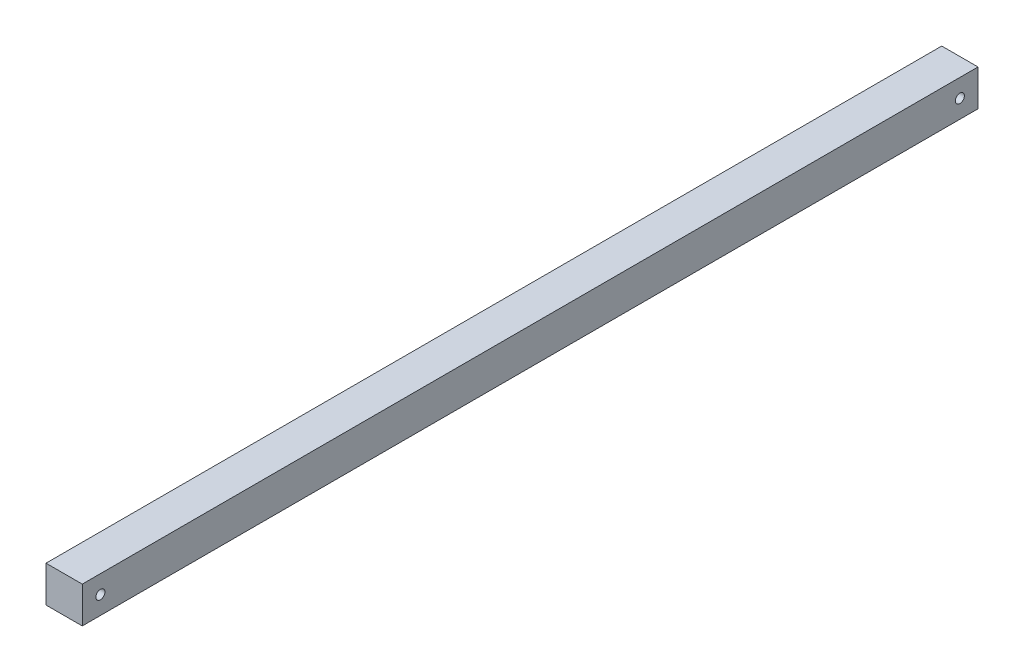
ISO-10303-21;
HEADER;
FILE_DESCRIPTION(('STEP AP214'),'2;1');
FILE_NAME('part.step','',(''),(''),'','','');
FILE_SCHEMA(('AUTOMOTIVE_DESIGN { 1 0 10303 214 1 1 1 1 }'));
ENDSEC;
DATA;
#1=APPLICATION_CONTEXT('core data for automotive mechanical design processes');
#2=APPLICATION_PROTOCOL_DEFINITION('international standard','automotive_design',2000,#1);
#3=PRODUCT_CONTEXT('',#1,'mechanical');
#4=PRODUCT('Part','Part','',(#3));
#5=PRODUCT_RELATED_PRODUCT_CATEGORY('part','',(#4));
#6=PRODUCT_DEFINITION_FORMATION('','',#4);
#7=PRODUCT_DEFINITION_CONTEXT('part definition',#1,'design');
#8=PRODUCT_DEFINITION('design','',#6,#7);
#9=PRODUCT_DEFINITION_SHAPE('','',#8);
#10=(LENGTH_UNIT() NAMED_UNIT(*) SI_UNIT(.MILLI.,.METRE.));
#11=(NAMED_UNIT(*) PLANE_ANGLE_UNIT() SI_UNIT($,.RADIAN.));
#12=(NAMED_UNIT(*) SI_UNIT($,.STERADIAN.) SOLID_ANGLE_UNIT());
#13=UNCERTAINTY_MEASURE_WITH_UNIT(LENGTH_MEASURE(1.E-05),#10,'distance_accuracy_value','');
#14=(GEOMETRIC_REPRESENTATION_CONTEXT(3) GLOBAL_UNCERTAINTY_ASSIGNED_CONTEXT((#13)) GLOBAL_UNIT_ASSIGNED_CONTEXT((#10,
#11,#12)) REPRESENTATION_CONTEXT('',''));
#15=CARTESIAN_POINT('',(0.,0.,0.));
#16=DIRECTION('',(0.,0.,1.));
#17=DIRECTION('',(1.,0.,0.));
#18=AXIS2_PLACEMENT_3D('',#15,#16,#17);
#19=CARTESIAN_POINT('',(0.,0.,0.));
#20=DIRECTION('',(0.,0.,1.));
#21=DIRECTION('',(1.,0.,0.));
#22=AXIS2_PLACEMENT_3D('',#19,#20,#21);
#23=PLANE('',#22);
#24=DIRECTION('',(0.,-1.,0.));
#25=VECTOR('',#24,1.);
#26=CARTESIAN_POINT('',(-5.,5.,0.));
#27=LINE('',#26,#25);
#28=CARTESIAN_POINT('',(-5.,5.,0.));
#29=VERTEX_POINT('',#28);
#30=CARTESIAN_POINT('',(-5.,-5.,0.));
#31=VERTEX_POINT('',#30);
#32=EDGE_CURVE('E85',#29,#31,#27,.T.);
#33=ORIENTED_EDGE('',*,*,#32,.F.);
#34=DIRECTION('',(-1.,0.,0.));
#35=VECTOR('',#34,1.);
#36=CARTESIAN_POINT('',(-5.,5.,0.));
#37=LINE('',#36,#35);
#38=CARTESIAN_POINT('',(5.,5.,0.));
#39=VERTEX_POINT('',#38);
#40=EDGE_CURVE('E100',#39,#29,#37,.T.);
#41=ORIENTED_EDGE('',*,*,#40,.F.);
#42=DIRECTION('',(0.,1.,0.));
#43=VECTOR('',#42,1.);
#44=CARTESIAN_POINT('',(5.,5.,0.));
#45=LINE('',#44,#43);
#46=CARTESIAN_POINT('',(5.,-5.,0.));
#47=VERTEX_POINT('',#46);
#48=EDGE_CURVE('E87',#47,#39,#45,.T.);
#49=ORIENTED_EDGE('',*,*,#48,.F.);
#50=DIRECTION('',(1.,0.,0.));
#51=VECTOR('',#50,1.);
#52=CARTESIAN_POINT('',(-5.,-5.,0.));
#53=LINE('',#52,#51);
#54=EDGE_CURVE('E77',#31,#47,#53,.T.);
#55=ORIENTED_EDGE('',*,*,#54,.F.);
#56=EDGE_LOOP('',(#33,#41,#49,#55));
#57=FACE_BOUND('',#56,.T.);
#58=ADVANCED_FACE('F35',(#57),#23,.F.);
#59=CARTESIAN_POINT('',(-5.,5.,261.142135623731));
#60=DIRECTION('',(0.,-1.,0.));
#61=DIRECTION('',(0.,0.,-1.));
#62=AXIS2_PLACEMENT_3D('',#59,#60,#61);
#63=PLANE('',#62);
#64=DIRECTION('',(0.,0.,-1.));
#65=VECTOR('',#64,1.);
#66=CARTESIAN_POINT('',(-5.,5.,261.142135623731));
#67=LINE('',#66,#65);
#68=CARTESIAN_POINT('',(-5.,5.,247.));
#69=VERTEX_POINT('',#68);
#70=EDGE_CURVE('E90',#69,#29,#67,.T.);
#71=ORIENTED_EDGE('',*,*,#70,.F.);
#72=DIRECTION('',(1.,0.,0.));
#73=VECTOR('',#72,1.);
#74=CARTESIAN_POINT('',(-5.,5.,247.));
#75=LINE('',#74,#73);
#76=CARTESIAN_POINT('',(5.,5.,247.));
#77=VERTEX_POINT('',#76);
#78=EDGE_CURVE('E39',#69,#77,#75,.T.);
#79=ORIENTED_EDGE('',*,*,#78,.T.);
#80=DIRECTION('',(0.,0.,-1.));
#81=VECTOR('',#80,1.);
#82=CARTESIAN_POINT('',(5.,5.,261.142135623731));
#83=LINE('',#82,#81);
#84=EDGE_CURVE('E103',#77,#39,#83,.T.);
#85=ORIENTED_EDGE('',*,*,#84,.T.);
#86=ORIENTED_EDGE('',*,*,#40,.T.);
#87=EDGE_LOOP('',(#71,#79,#85,#86));
#88=FACE_BOUND('',#87,.T.);
#89=ADVANCED_FACE('F141',(#88),#63,.F.);
#90=CARTESIAN_POINT('',(5.,5.,261.142135623731));
#91=DIRECTION('',(-1.,0.,0.));
#92=DIRECTION('',(0.,-1.,0.));
#93=AXIS2_PLACEMENT_3D('',#90,#91,#92);
#94=PLANE('',#93);
#95=CARTESIAN_POINT('',(5.,0.,242.));
#96=DIRECTION('',(-1.,0.,0.));
#97=DIRECTION('',(0.,0.,1.));
#98=AXIS2_PLACEMENT_3D('',#95,#96,#97);
#99=CIRCLE('',#98,1.25);
#100=CARTESIAN_POINT('',(5.,0.,243.25));
#101=VERTEX_POINT('',#100);
#102=EDGE_CURVE('E114',#101,#101,#99,.T.);
#103=ORIENTED_EDGE('',*,*,#102,.T.);
#104=EDGE_LOOP('',(#103));
#105=FACE_BOUND('',#104,.T.);
#106=CARTESIAN_POINT('',(5.,0.,5.));
#107=DIRECTION('',(-1.,0.,0.));
#108=DIRECTION('',(0.,0.,1.));
#109=AXIS2_PLACEMENT_3D('',#106,#107,#108);
#110=CIRCLE('',#109,1.25);
#111=CARTESIAN_POINT('',(5.,0.,6.25));
#112=VERTEX_POINT('',#111);
#113=EDGE_CURVE('E92',#112,#112,#110,.T.);
#114=ORIENTED_EDGE('',*,*,#113,.T.);
#115=EDGE_LOOP('',(#114));
#116=FACE_BOUND('',#115,.T.);
#117=ORIENTED_EDGE('',*,*,#84,.F.);
#118=DIRECTION('',(0.,-1.,0.));
#119=VECTOR('',#118,1.);
#120=CARTESIAN_POINT('',(5.,5.,247.));
#121=LINE('',#120,#119);
#122=CARTESIAN_POINT('',(5.,-5.,247.));
#123=VERTEX_POINT('',#122);
#124=EDGE_CURVE('E109',#77,#123,#121,.T.);
#125=ORIENTED_EDGE('',*,*,#124,.T.);
#126=DIRECTION('',(0.,0.,-1.));
#127=VECTOR('',#126,1.);
#128=CARTESIAN_POINT('',(5.,-5.,261.142135623731));
#129=LINE('',#128,#127);
#130=EDGE_CURVE('E81',#123,#47,#129,.T.);
#131=ORIENTED_EDGE('',*,*,#130,.T.);
#132=ORIENTED_EDGE('',*,*,#48,.T.);
#133=EDGE_LOOP('',(#117,#125,#131,#132));
#134=FACE_BOUND('',#133,.T.);
#135=ADVANCED_FACE('F108',(#105,#116,#134),#94,.F.);
#136=CARTESIAN_POINT('',(-5.,-5.,261.142135623731));
#137=DIRECTION('',(0.,1.,0.));
#138=DIRECTION('',(0.,0.,1.));
#139=AXIS2_PLACEMENT_3D('',#136,#137,#138);
#140=PLANE('',#139);
#141=ORIENTED_EDGE('',*,*,#130,.F.);
#142=DIRECTION('',(-1.,0.,0.));
#143=VECTOR('',#142,1.);
#144=CARTESIAN_POINT('',(-5.,-5.,247.));
#145=LINE('',#144,#143);
#146=CARTESIAN_POINT('',(-5.,-5.,247.));
#147=VERTEX_POINT('',#146);
#148=EDGE_CURVE('E44',#123,#147,#145,.T.);
#149=ORIENTED_EDGE('',*,*,#148,.T.);
#150=DIRECTION('',(0.,0.,-1.));
#151=VECTOR('',#150,1.);
#152=CARTESIAN_POINT('',(-5.,-5.,261.142135623731));
#153=LINE('',#152,#151);
#154=EDGE_CURVE('E74',#147,#31,#153,.T.);
#155=ORIENTED_EDGE('',*,*,#154,.T.);
#156=ORIENTED_EDGE('',*,*,#54,.T.);
#157=EDGE_LOOP('',(#141,#149,#155,#156));
#158=FACE_BOUND('',#157,.T.);
#159=ADVANCED_FACE('F76',(#158),#140,.F.);
#160=CARTESIAN_POINT('',(-5.,5.,261.142135623731));
#161=DIRECTION('',(1.,0.,0.));
#162=DIRECTION('',(0.,1.,0.));
#163=AXIS2_PLACEMENT_3D('',#160,#161,#162);
#164=PLANE('',#163);
#165=CARTESIAN_POINT('',(-5.,0.,242.));
#166=DIRECTION('',(-1.,0.,0.));
#167=DIRECTION('',(0.,0.,1.));
#168=AXIS2_PLACEMENT_3D('',#165,#166,#167);
#169=CIRCLE('',#168,1.24999999999999);
#170=CARTESIAN_POINT('',(-5.,0.,243.25));
#171=VERTEX_POINT('',#170);
#172=EDGE_CURVE('E117',#171,#171,#169,.T.);
#173=ORIENTED_EDGE('',*,*,#172,.F.);
#174=EDGE_LOOP('',(#173));
#175=FACE_BOUND('',#174,.T.);
#176=CARTESIAN_POINT('',(-5.,0.,5.));
#177=DIRECTION('',(-1.,0.,0.));
#178=DIRECTION('',(0.,0.,1.));
#179=AXIS2_PLACEMENT_3D('',#176,#177,#178);
#180=CIRCLE('',#179,1.24999999999999);
#181=CARTESIAN_POINT('',(-5.,0.,6.24999999999999));
#182=VERTEX_POINT('',#181);
#183=EDGE_CURVE('E95',#182,#182,#180,.T.);
#184=ORIENTED_EDGE('',*,*,#183,.F.);
#185=EDGE_LOOP('',(#184));
#186=FACE_BOUND('',#185,.T.);
#187=ORIENTED_EDGE('',*,*,#154,.F.);
#188=DIRECTION('',(0.,1.,0.));
#189=VECTOR('',#188,1.);
#190=CARTESIAN_POINT('',(-5.,5.,247.));
#191=LINE('',#190,#189);
#192=EDGE_CURVE('E11',#147,#69,#191,.T.);
#193=ORIENTED_EDGE('',*,*,#192,.T.);
#194=ORIENTED_EDGE('',*,*,#70,.T.);
#195=ORIENTED_EDGE('',*,*,#32,.T.);
#196=EDGE_LOOP('',(#187,#193,#194,#195));
#197=FACE_BOUND('',#196,.T.);
#198=ADVANCED_FACE('F37',(#175,#186,#197),#164,.F.);
#199=CARTESIAN_POINT('',(5.00000000000003,-308.34213562373,247.));
#200=DIRECTION('',(0.,0.,-1.));
#201=DIRECTION('',(1.,0.,0.));
#202=AXIS2_PLACEMENT_3D('',#199,#200,#201);
#203=PLANE('',#202);
#204=ORIENTED_EDGE('',*,*,#148,.F.);
#205=ORIENTED_EDGE('',*,*,#124,.F.);
#206=ORIENTED_EDGE('',*,*,#78,.F.);
#207=ORIENTED_EDGE('',*,*,#192,.F.);
#208=EDGE_LOOP('',(#204,#205,#206,#207));
#209=FACE_BOUND('',#208,.T.);
#210=ADVANCED_FACE('F125',(#209),#203,.F.);
#211=CARTESIAN_POINT('',(-5.,0.,5.));
#212=DIRECTION('',(-1.,0.,0.));
#213=DIRECTION('',(0.,0.,1.));
#214=AXIS2_PLACEMENT_3D('',#211,#212,#213);
#215=CYLINDRICAL_SURFACE('',#214,1.24999999999999);
#216=ORIENTED_EDGE('',*,*,#113,.F.);
#217=EDGE_LOOP('',(#216));
#218=FACE_BOUND('',#217,.T.);
#219=ORIENTED_EDGE('',*,*,#183,.T.);
#220=EDGE_LOOP('',(#219));
#221=FACE_BOUND('',#220,.T.);
#222=ADVANCED_FACE('F128',(#218,#221),#215,.F.);
#223=CARTESIAN_POINT('',(-5.,0.,242.));
#224=DIRECTION('',(-1.,0.,0.));
#225=DIRECTION('',(0.,0.,1.));
#226=AXIS2_PLACEMENT_3D('',#223,#224,#225);
#227=CYLINDRICAL_SURFACE('',#226,1.24999999999999);
#228=ORIENTED_EDGE('',*,*,#102,.F.);
#229=EDGE_LOOP('',(#228));
#230=FACE_BOUND('',#229,.T.);
#231=ORIENTED_EDGE('',*,*,#172,.T.);
#232=EDGE_LOOP('',(#231));
#233=FACE_BOUND('',#232,.T.);
#234=ADVANCED_FACE('F121',(#230,#233),#227,.F.);
#235=CLOSED_SHELL('',(#58,#89,#135,#159,#198,#210,#222,#234));
#236=MANIFOLD_SOLID_BREP('B2',#235);
#237=ADVANCED_BREP_SHAPE_REPRESENTATION('',(#18,#236),#14);
#238=SHAPE_DEFINITION_REPRESENTATION(#9,#237);
ENDSEC;
END-ISO-10303-21;
